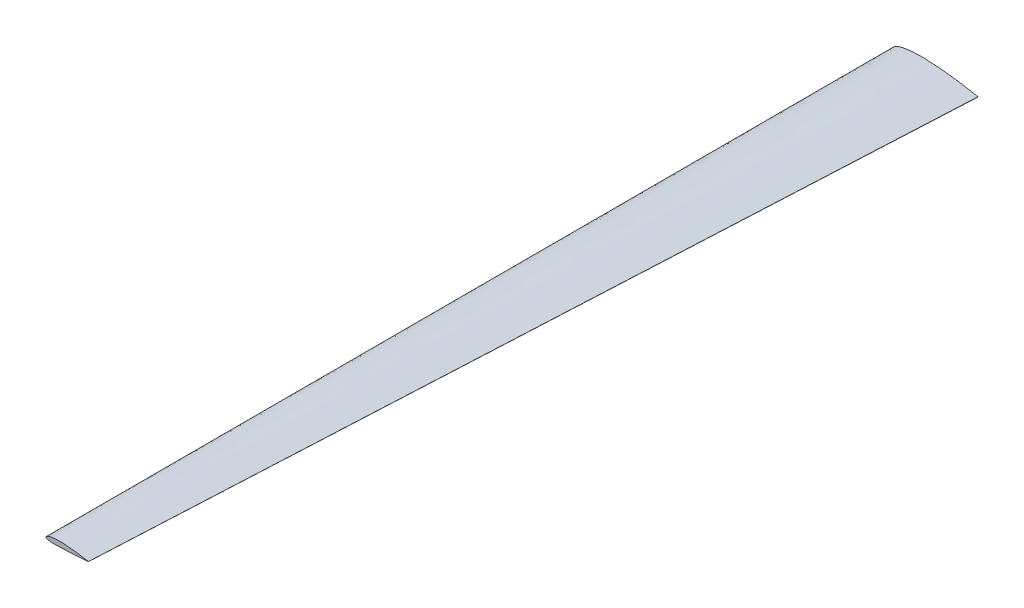
ISO-10303-21;
HEADER;
FILE_DESCRIPTION(('STEP AP214'),'2;1');
FILE_NAME('part.step','',(''),(''),'','','');
FILE_SCHEMA(('AUTOMOTIVE_DESIGN { 1 0 10303 214 1 1 1 1 }'));
ENDSEC;
DATA;
#1=APPLICATION_CONTEXT('core data for automotive mechanical design processes');
#2=APPLICATION_PROTOCOL_DEFINITION('international standard','automotive_design',2000,#1);
#3=PRODUCT_CONTEXT('',#1,'mechanical');
#4=PRODUCT('Part','Part','',(#3));
#5=PRODUCT_RELATED_PRODUCT_CATEGORY('part','',(#4));
#6=PRODUCT_DEFINITION_FORMATION('','',#4);
#7=PRODUCT_DEFINITION_CONTEXT('part definition',#1,'design');
#8=PRODUCT_DEFINITION('design','',#6,#7);
#9=PRODUCT_DEFINITION_SHAPE('','',#8);
#10=(LENGTH_UNIT() NAMED_UNIT(*) SI_UNIT(.MILLI.,.METRE.));
#11=(NAMED_UNIT(*) PLANE_ANGLE_UNIT() SI_UNIT($,.RADIAN.));
#12=(NAMED_UNIT(*) SI_UNIT($,.STERADIAN.) SOLID_ANGLE_UNIT());
#13=UNCERTAINTY_MEASURE_WITH_UNIT(LENGTH_MEASURE(1.E-05),#10,'distance_accuracy_value','');
#14=(GEOMETRIC_REPRESENTATION_CONTEXT(3) GLOBAL_UNCERTAINTY_ASSIGNED_CONTEXT((#13)) GLOBAL_UNIT_ASSIGNED_CONTEXT((#10,
#11,#12)) REPRESENTATION_CONTEXT('',''));
#15=CARTESIAN_POINT('',(0.,0.,0.));
#16=DIRECTION('',(0.,0.,1.));
#17=DIRECTION('',(1.,0.,0.));
#18=AXIS2_PLACEMENT_3D('',#15,#16,#17);
#19=CARTESIAN_POINT('',(0.0236198998838044,0.166879513452411,0.));
#20=DIRECTION('',(0.,0.,-1.));
#21=DIRECTION('',(-1.,0.,0.));
#22=AXIS2_PLACEMENT_3D('',#19,#20,#21);
#23=PLANE('',#22);
#24=CARTESIAN_POINT('',(25.4,0.03302,0.));
#25=CARTESIAN_POINT('',(24.9769014640824,0.119718673605576,0.));
#26=CARTESIAN_POINT('',(24.1318156272476,0.292888313574983,0.));
#27=CARTESIAN_POINT('',(22.4401926699359,0.610072383581979,0.));
#28=CARTESIAN_POINT('',(20.3245245059603,0.961512594832017,0.));
#29=CARTESIAN_POINT('',(17.7840425664312,1.32524464258681,0.));
#30=CARTESIAN_POINT('',(15.2439797011364,1.62858373005082,0.));
#31=CARTESIAN_POINT('',(12.7028156198307,1.85069315013333,0.));
#32=CARTESIAN_POINT('',(10.162230248499,2.00110489700424,0.));
#33=CARTESIAN_POINT('',(8.04254293251606,2.02656511179666,0.));
#34=CARTESIAN_POINT('',(6.34846376343124,1.95643209768798,0.));
#35=CARTESIAN_POINT('',(5.07686549060277,1.85366696556124,0.));
#36=CARTESIAN_POINT('',(3.80366183927406,1.69093169308701,0.));
#37=CARTESIAN_POINT('',(2.74403982607792,1.49053579300544,0.));
#38=CARTESIAN_POINT('',(1.89928836224109,1.2638171283089,0.));
#39=CARTESIAN_POINT('',(1.25884745054821,1.05769632452647,0.));
#40=CARTESIAN_POINT('',(0.716235124109915,0.817534629556015,0.));
#41=CARTESIAN_POINT('',(0.24818263691079,0.526365140460425,0.));
#42=CARTESIAN_POINT('',(-0.159975015652478,0.0228287879404349,0.));
#43=CARTESIAN_POINT('',(0.263992036497741,-0.419770576793592,0.));
#44=CARTESIAN_POINT('',(0.723289703649869,-0.621636235824618,0.));
#45=CARTESIAN_POINT('',(1.26351482022312,-0.774974615140498,0.));
#46=CARTESIAN_POINT('',(1.9018472227622,-0.884918647336862,0.));
#47=CARTESIAN_POINT('',(2.74997954749982,-0.97874363201767,0.));
#48=CARTESIAN_POINT('',(3.80865459261181,-1.05095950779008,0.));
#49=CARTESIAN_POINT('',(5.07985044661686,-1.07991297965441,0.));
#50=CARTESIAN_POINT('',(6.35013904779939,-1.07587821606776,0.));
#51=CARTESIAN_POINT('',(8.0436292869457,-1.03849708735601,0.));
#52=CARTESIAN_POINT('',(10.1606896976337,-0.97123190451925,0.));
#53=CARTESIAN_POINT('',(12.7008480845517,-0.854170101473362,0.));
#54=CARTESIAN_POINT('',(15.2402699033373,-0.702018840496078,0.));
#55=CARTESIAN_POINT('',(17.7801224315762,-0.543869785792335,0.));
#56=CARTESIAN_POINT('',(20.3204092307799,-0.383788789082956,0.));
#57=CARTESIAN_POINT('',(22.4366183871646,-0.236354892827314,0.));
#58=CARTESIAN_POINT('',(24.1301077065703,-0.122636430062126,0.));
#59=CARTESIAN_POINT('',(24.9766831899032,-0.0628935109287976,0.));
#60=CARTESIAN_POINT('',(25.4,-0.03302,0.));
#61=B_SPLINE_CURVE_WITH_KNOTS('',3,(#24,#25,#26,#27,#28,#29,#30,#31,#32,#33,#34,#35,#36,#37,#38,
#39,#40,#41,#42,#43,#44,#45,#46,#47,#48,#49,#50,#51,#52,#53,#54,#55,#56,#57,#58,#59,#60),
.UNSPECIFIED.,.F.,.F.,(4,1,1,1,1,1,1,1,1,1,1,1,1,1,1,1,1,1,1,1,1,1,1,1,1,1,1,1,1,1,1,1,1,1,4),
(0.,0.0250124897498648,0.0499592861642578,0.0996729249269685,0.149206319909966,
0.198581096615965,0.247805170456833,0.296916574601493,0.345952721793533,0.370491625569911,
0.395091203654929,0.41981479582396,0.444798575016595,0.457489818915221,0.47040640543549,
0.483879408669829,0.491264120322896,0.503458853294664,0.513609129403887,0.520450990700287,
0.533235387615153,0.545691039147803,0.558031884237173,0.582609167247894,0.607134741746914,
0.631652079836766,0.656174271859652,0.705233949250519,0.754320378530032,0.803437363555032,
0.852566095729537,0.901700994033254,0.95084880933727,0.975422716989278,1.),.UNSPECIFIED.);
#62=CARTESIAN_POINT('',(25.4,0.03302,0.));
#63=VERTEX_POINT('',#62);
#64=CARTESIAN_POINT('',(25.4,-0.03302,0.));
#65=VERTEX_POINT('',#64);
#66=EDGE_CURVE('E72',#63,#65,#61,.T.);
#67=ORIENTED_EDGE('',*,*,#66,.F.);
#68=DIRECTION('',(0.,1.,0.));
#69=VECTOR('',#68,1.);
#70=CARTESIAN_POINT('',(25.4,0.03302,0.));
#71=LINE('',#70,#69);
#72=EDGE_CURVE('E12',#65,#63,#71,.T.);
#73=ORIENTED_EDGE('',*,*,#72,.F.);
#74=EDGE_LOOP('',(#67,#73));
#75=FACE_BOUND('',#74,.T.);
#76=ADVANCED_FACE('F61',(#75),#23,.T.);
#77=CARTESIAN_POINT('',(0.0118099499419022,0.0834397567262057,254.));
#78=DIRECTION('',(0.,0.,-1.));
#79=DIRECTION('',(-1.,0.,0.));
#80=AXIS2_PLACEMENT_3D('',#77,#78,#79);
#81=PLANE('',#80);
#82=CARTESIAN_POINT('',(12.7,0.01651,254.));
#83=CARTESIAN_POINT('',(12.4884507320412,0.0598593368027881,254.));
#84=CARTESIAN_POINT('',(12.0659078136238,0.146444156787492,254.));
#85=CARTESIAN_POINT('',(11.220096334968,0.30503619179099,254.));
#86=CARTESIAN_POINT('',(10.1622622529801,0.480756297416009,254.));
#87=CARTESIAN_POINT('',(8.89202128321559,0.662622321293407,254.));
#88=CARTESIAN_POINT('',(7.62198985056818,0.814291865025408,254.));
#89=CARTESIAN_POINT('',(6.35140780991534,0.925346575066663,254.));
#90=CARTESIAN_POINT('',(5.08111512424949,1.00055244850212,254.));
#91=CARTESIAN_POINT('',(4.02127146625803,1.01328255589833,254.));
#92=CARTESIAN_POINT('',(3.17423188171562,0.978216048843989,254.));
#93=CARTESIAN_POINT('',(2.53843274530138,0.92683348278062,254.));
#94=CARTESIAN_POINT('',(1.90183091963703,0.845465846543504,254.));
#95=CARTESIAN_POINT('',(1.37201991303896,0.745267896502721,254.));
#96=CARTESIAN_POINT('',(0.949644181120544,0.631908564154448,254.));
#97=CARTESIAN_POINT('',(0.629423725274107,0.528848162263236,254.));
#98=CARTESIAN_POINT('',(0.358117562054957,0.408767314778007,254.));
#99=CARTESIAN_POINT('',(0.124091318455395,0.263182570230213,254.));
#100=CARTESIAN_POINT('',(-0.0799875078262389,0.0114143939702174,254.));
#101=CARTESIAN_POINT('',(0.13199601824887,-0.209885288396796,254.));
#102=CARTESIAN_POINT('',(0.361644851824935,-0.310818117912309,254.));
#103=CARTESIAN_POINT('',(0.63175741011156,-0.387487307570249,254.));
#104=CARTESIAN_POINT('',(0.950923611381102,-0.442459323668431,254.));
#105=CARTESIAN_POINT('',(1.37498977374991,-0.489371816008835,254.));
#106=CARTESIAN_POINT('',(1.9043272963059,-0.525479753895041,254.));
#107=CARTESIAN_POINT('',(2.53992522330843,-0.539956489827206,254.));
#108=CARTESIAN_POINT('',(3.17506952389969,-0.537939108033878,254.));
#109=CARTESIAN_POINT('',(4.02181464347285,-0.519248543678003,254.));
#110=CARTESIAN_POINT('',(5.08034484881686,-0.485615952259625,254.));
#111=CARTESIAN_POINT('',(6.35042404227586,-0.427085050736681,254.));
#112=CARTESIAN_POINT('',(7.62013495166866,-0.351009420248039,254.));
#113=CARTESIAN_POINT('',(8.89006121578812,-0.271934892896167,254.));
#114=CARTESIAN_POINT('',(10.16020461539,-0.191894394541478,254.));
#115=CARTESIAN_POINT('',(11.2183091935823,-0.118177446413657,254.));
#116=CARTESIAN_POINT('',(12.0650538532852,-0.0613182150310631,254.));
#117=CARTESIAN_POINT('',(12.4883415949516,-0.0314467554643988,254.));
#118=CARTESIAN_POINT('',(12.7,-0.01651,254.));
#119=B_SPLINE_CURVE_WITH_KNOTS('',3,(#82,#83,#84,#85,#86,#87,#88,#89,#90,#91,#92,#93,#94,#95,
#96,#97,#98,#99,#100,#101,#102,#103,#104,#105,#106,#107,#108,#109,#110,#111,#112,#113,#114,#115,
#116,#117,#118),.UNSPECIFIED.,.F.,.F.,(4,1,1,1,1,1,1,1,1,1,1,1,1,1,1,1,1,1,1,1,1,1,1,1,1,1,1,1,
1,1,1,1,1,1,4),(0.,0.0250124897498648,0.0499592861642578,0.0996729249269685,0.149206319909966,
0.198581096615965,0.247805170456833,0.296916574601493,0.345952721793533,0.370491625569911,
0.395091203654929,0.41981479582396,0.444798575016595,0.457489818915221,0.47040640543549,
0.483879408669829,0.491264120322896,0.503458853294664,0.513609129403887,0.520450990700287,
0.533235387615153,0.545691039147803,0.558031884237173,0.582609167247894,0.607134741746914,
0.631652079836766,0.656174271859652,0.705233949250519,0.754320378530032,0.803437363555032,
0.852566095729537,0.901700994033254,0.95084880933727,0.975422716989278,1.),.UNSPECIFIED.);
#120=CARTESIAN_POINT('',(12.7,0.01651,254.));
#121=VERTEX_POINT('',#120);
#122=CARTESIAN_POINT('',(12.7,-0.01651,254.));
#123=VERTEX_POINT('',#122);
#124=EDGE_CURVE('E97',#121,#123,#119,.T.);
#125=ORIENTED_EDGE('',*,*,#124,.T.);
#126=DIRECTION('',(0.,1.,0.));
#127=VECTOR('',#126,1.);
#128=CARTESIAN_POINT('',(12.7,0.01651,254.));
#129=LINE('',#128,#127);
#130=EDGE_CURVE('E94',#123,#121,#129,.T.);
#131=ORIENTED_EDGE('',*,*,#130,.T.);
#132=EDGE_LOOP('',(#125,#131));
#133=FACE_BOUND('',#132,.T.);
#134=ADVANCED_FACE('F96',(#133),#81,.F.);
#135=CARTESIAN_POINT('',(12.7,-0.01651,254.));
#136=CARTESIAN_POINT('',(25.4,-0.03302,0.));
#137=CARTESIAN_POINT('',(12.4883415949516,-0.0314467554643988,254.));
#138=CARTESIAN_POINT('',(24.9766831899032,-0.0628935109287976,0.));
#139=CARTESIAN_POINT('',(12.0650538532852,-0.0613182150310631,254.));
#140=CARTESIAN_POINT('',(24.1301077065703,-0.122636430062126,0.));
#141=CARTESIAN_POINT('',(11.2183091935823,-0.118177446413657,254.));
#142=CARTESIAN_POINT('',(22.4366183871646,-0.236354892827314,0.));
#143=CARTESIAN_POINT('',(10.16020461539,-0.191894394541478,254.));
#144=CARTESIAN_POINT('',(20.3204092307799,-0.383788789082956,0.));
#145=CARTESIAN_POINT('',(8.89006121578812,-0.271934892896167,254.));
#146=CARTESIAN_POINT('',(17.7801224315762,-0.543869785792335,0.));
#147=CARTESIAN_POINT('',(7.62013495166866,-0.351009420248039,254.));
#148=CARTESIAN_POINT('',(15.2402699033373,-0.702018840496078,0.));
#149=CARTESIAN_POINT('',(6.35042404227586,-0.427085050736681,254.));
#150=CARTESIAN_POINT('',(12.7008480845517,-0.854170101473362,0.));
#151=CARTESIAN_POINT('',(5.08034484881686,-0.485615952259625,254.));
#152=CARTESIAN_POINT('',(10.1606896976337,-0.97123190451925,0.));
#153=CARTESIAN_POINT('',(4.02181464347285,-0.519248543678003,254.));
#154=CARTESIAN_POINT('',(8.0436292869457,-1.03849708735601,0.));
#155=CARTESIAN_POINT('',(3.17506952389969,-0.537939108033878,254.));
#156=CARTESIAN_POINT('',(6.35013904779939,-1.07587821606776,0.));
#157=CARTESIAN_POINT('',(2.53992522330843,-0.539956489827206,254.));
#158=CARTESIAN_POINT('',(5.07985044661686,-1.07991297965441,0.));
#159=CARTESIAN_POINT('',(1.9043272963059,-0.525479753895041,254.));
#160=CARTESIAN_POINT('',(3.80865459261181,-1.05095950779008,0.));
#161=CARTESIAN_POINT('',(1.37498977374991,-0.489371816008835,254.));
#162=CARTESIAN_POINT('',(2.74997954749982,-0.97874363201767,0.));
#163=CARTESIAN_POINT('',(0.950923611381102,-0.442459323668431,254.));
#164=CARTESIAN_POINT('',(1.9018472227622,-0.884918647336862,0.));
#165=CARTESIAN_POINT('',(0.63175741011156,-0.387487307570249,254.));
#166=CARTESIAN_POINT('',(1.26351482022312,-0.774974615140498,0.));
#167=CARTESIAN_POINT('',(0.361644851824935,-0.310818117912309,254.));
#168=CARTESIAN_POINT('',(0.723289703649869,-0.621636235824618,0.));
#169=CARTESIAN_POINT('',(0.13199601824887,-0.209885288396796,254.));
#170=CARTESIAN_POINT('',(0.263992036497741,-0.419770576793592,0.));
#171=CARTESIAN_POINT('',(-0.0799875078262389,0.0114143939702174,254.));
#172=CARTESIAN_POINT('',(-0.159975015652478,0.0228287879404349,0.));
#173=CARTESIAN_POINT('',(0.124091318455395,0.263182570230213,254.));
#174=CARTESIAN_POINT('',(0.24818263691079,0.526365140460425,0.));
#175=CARTESIAN_POINT('',(0.358117562054957,0.408767314778007,254.));
#176=CARTESIAN_POINT('',(0.716235124109915,0.817534629556015,0.));
#177=CARTESIAN_POINT('',(0.629423725274107,0.528848162263236,254.));
#178=CARTESIAN_POINT('',(1.25884745054821,1.05769632452647,0.));
#179=CARTESIAN_POINT('',(0.949644181120544,0.631908564154448,254.));
#180=CARTESIAN_POINT('',(1.89928836224109,1.2638171283089,0.));
#181=CARTESIAN_POINT('',(1.37201991303896,0.745267896502721,254.));
#182=CARTESIAN_POINT('',(2.74403982607792,1.49053579300544,0.));
#183=CARTESIAN_POINT('',(1.90183091963703,0.845465846543504,254.));
#184=CARTESIAN_POINT('',(3.80366183927406,1.69093169308701,0.));
#185=CARTESIAN_POINT('',(2.53843274530138,0.92683348278062,254.));
#186=CARTESIAN_POINT('',(5.07686549060277,1.85366696556124,0.));
#187=CARTESIAN_POINT('',(3.17423188171562,0.978216048843989,254.));
#188=CARTESIAN_POINT('',(6.34846376343124,1.95643209768798,0.));
#189=CARTESIAN_POINT('',(4.02127146625803,1.01328255589833,254.));
#190=CARTESIAN_POINT('',(8.04254293251606,2.02656511179666,0.));
#191=CARTESIAN_POINT('',(5.08111512424949,1.00055244850212,254.));
#192=CARTESIAN_POINT('',(10.162230248499,2.00110489700424,0.));
#193=CARTESIAN_POINT('',(6.35140780991534,0.925346575066663,254.));
#194=CARTESIAN_POINT('',(12.7028156198307,1.85069315013333,0.));
#195=CARTESIAN_POINT('',(7.62198985056818,0.814291865025408,254.));
#196=CARTESIAN_POINT('',(15.2439797011364,1.62858373005082,0.));
#197=CARTESIAN_POINT('',(8.89202128321559,0.662622321293407,254.));
#198=CARTESIAN_POINT('',(17.7840425664312,1.32524464258681,0.));
#199=CARTESIAN_POINT('',(10.1622622529801,0.480756297416009,254.));
#200=CARTESIAN_POINT('',(20.3245245059603,0.961512594832017,0.));
#201=CARTESIAN_POINT('',(11.220096334968,0.30503619179099,254.));
#202=CARTESIAN_POINT('',(22.4401926699359,0.610072383581979,0.));
#203=CARTESIAN_POINT('',(12.0659078136238,0.146444156787492,254.));
#204=CARTESIAN_POINT('',(24.1318156272476,0.292888313574983,0.));
#205=CARTESIAN_POINT('',(12.4884507320412,0.0598593368027881,254.));
#206=CARTESIAN_POINT('',(24.9769014640824,0.119718673605576,0.));
#207=CARTESIAN_POINT('',(12.7,0.01651,254.));
#208=CARTESIAN_POINT('',(25.4,0.03302,0.));
#209=B_SPLINE_SURFACE_WITH_KNOTS('',3,1,((#135,#136),(#137,#138),(#139,#140),(#141,#142),(#143,
#144),(#145,#146),(#147,#148),(#149,#150),(#151,#152),(#153,#154),(#155,#156),(#157,#158),(#159,
#160),(#161,#162),(#163,#164),(#165,#166),(#167,#168),(#169,#170),(#171,#172),(#173,#174),(#175,
#176),(#177,#178),(#179,#180),(#181,#182),(#183,#184),(#185,#186),(#187,#188),(#189,#190),(#191,
#192),(#193,#194),(#195,#196),(#197,#198),(#199,#200),(#201,#202),(#203,#204),(#205,#206),(#207,
#208)),.UNSPECIFIED.,.F.,.F.,.F.,(4,1,1,1,1,1,1,1,1,1,1,1,1,1,1,1,1,1,1,1,1,1,1,1,1,1,1,1,1,1,1,
1,1,1,4),(2,2),(0.,0.0245772830107216,0.0491511906627297,0.0982990059667456,0.147433904270463,
0.196562636444968,0.245679621469968,0.294766050749481,0.343825728140348,0.368347920163234,
0.392865258253086,0.417390832752106,0.441968115762827,0.454308960852197,0.466764612384847,
0.479549009299713,0.486390870596113,0.496541146705336,0.508735879677104,0.516120591330171,
0.52959359456451,0.542510181084779,0.555201424983405,0.58018520417604,0.604908796345071,
0.629508374430089,0.654047278206467,0.703083425398507,0.752194829543168,0.801418903384035,
0.850793680090034,0.900327075073031,0.950040713835742,0.974987510250135,1.),(0.,1.),.UNSPECIFIED.);
#210=DIRECTION('',(0.0499376168386621,6.49189018902607E-05,-0.998752336773242));
#211=VECTOR('',#210,1.);
#212=CARTESIAN_POINT('',(19.05,0.024765,127.));
#213=LINE('',#212,#211);
#214=EDGE_CURVE('E85',#121,#63,#213,.T.);
#215=DIRECTION('',(-0.0499376168386621,6.49189018902607E-05,0.998752336773242));
#216=VECTOR('',#215,1.);
#217=CARTESIAN_POINT('',(19.05,-0.024765,127.));
#218=LINE('',#217,#216);
#219=EDGE_CURVE('E103',#65,#123,#218,.T.);
#220=ORIENTED_EDGE('',*,*,#124,.F.);
#221=ORIENTED_EDGE('',*,*,#214,.T.);
#222=ORIENTED_EDGE('',*,*,#66,.T.);
#223=ORIENTED_EDGE('',*,*,#219,.T.);
#224=EDGE_LOOP('',(#220,#221,#222,#223));
#225=FACE_BOUND('',#224,.T.);
#226=ADVANCED_FACE('F108',(#225),#209,.T.);
#227=CARTESIAN_POINT('',(25.3366583541147,1.33107498636241E-12,1.26683291770574));
#228=DIRECTION('',(0.998752338877845,0.,0.0499376169438922));
#229=DIRECTION('',(0.0499376169438923,0.,-0.998752338877845));
#230=AXIS2_PLACEMENT_3D('',#227,#228,#229);
#231=PLANE('',#230);
#232=ORIENTED_EDGE('',*,*,#219,.F.);
#233=ORIENTED_EDGE('',*,*,#72,.T.);
#234=ORIENTED_EDGE('',*,*,#214,.F.);
#235=ORIENTED_EDGE('',*,*,#130,.F.);
#236=EDGE_LOOP('',(#232,#233,#234,#235));
#237=FACE_BOUND('',#236,.T.);
#238=ADVANCED_FACE('F113',(#237),#231,.T.);
#239=CLOSED_SHELL('',(#76,#134,#226,#238));
#240=MANIFOLD_SOLID_BREP('B2',#239);
#241=ADVANCED_BREP_SHAPE_REPRESENTATION('',(#18,#240),#14);
#242=SHAPE_DEFINITION_REPRESENTATION(#9,#241);
ENDSEC;
END-ISO-10303-21;
